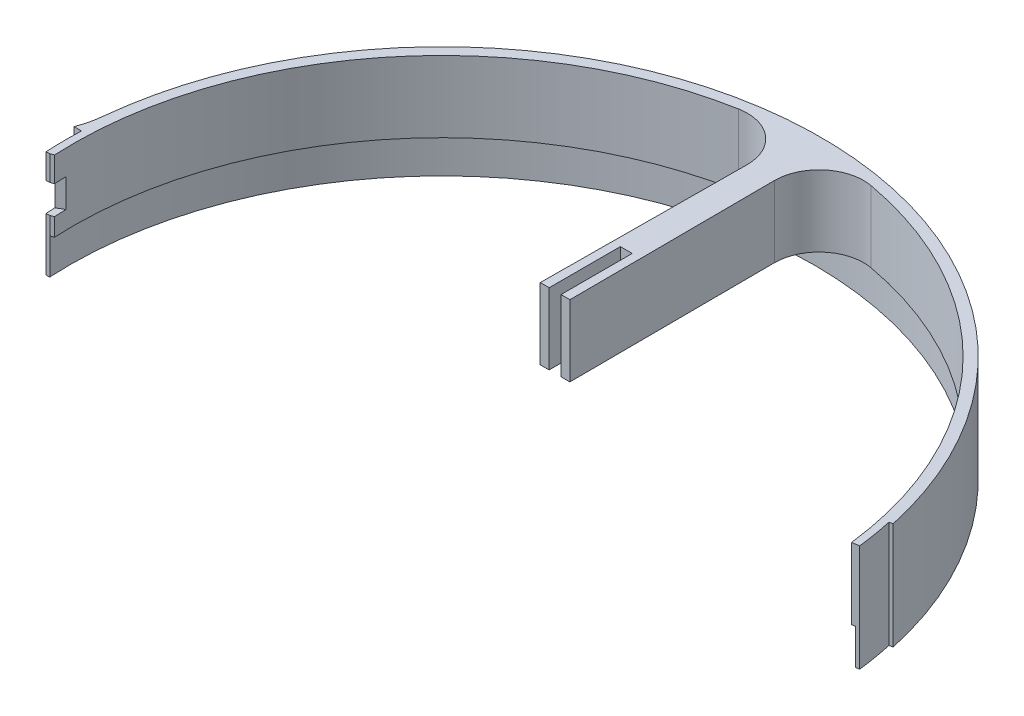
ISO-10303-21;
HEADER;
FILE_DESCRIPTION(('STEP AP214'),'2;1');
FILE_NAME('part.step','',(''),(''),'','','');
FILE_SCHEMA(('AUTOMOTIVE_DESIGN { 1 0 10303 214 1 1 1 1 }'));
ENDSEC;
DATA;
#1=APPLICATION_CONTEXT('core data for automotive mechanical design processes');
#2=APPLICATION_PROTOCOL_DEFINITION('international standard','automotive_design',2000,#1);
#3=PRODUCT_CONTEXT('',#1,'mechanical');
#4=PRODUCT('Part','Part','',(#3));
#5=PRODUCT_RELATED_PRODUCT_CATEGORY('part','',(#4));
#6=PRODUCT_DEFINITION_FORMATION('','',#4);
#7=PRODUCT_DEFINITION_CONTEXT('part definition',#1,'design');
#8=PRODUCT_DEFINITION('design','',#6,#7);
#9=PRODUCT_DEFINITION_SHAPE('','',#8);
#10=(LENGTH_UNIT() NAMED_UNIT(*) SI_UNIT(.MILLI.,.METRE.));
#11=(NAMED_UNIT(*) PLANE_ANGLE_UNIT() SI_UNIT($,.RADIAN.));
#12=(NAMED_UNIT(*) SI_UNIT($,.STERADIAN.) SOLID_ANGLE_UNIT());
#13=UNCERTAINTY_MEASURE_WITH_UNIT(LENGTH_MEASURE(1.E-05),#10,'distance_accuracy_value','');
#14=(GEOMETRIC_REPRESENTATION_CONTEXT(3) GLOBAL_UNCERTAINTY_ASSIGNED_CONTEXT((#13)) GLOBAL_UNIT_ASSIGNED_CONTEXT((#10,
#11,#12)) REPRESENTATION_CONTEXT('',''));
#15=CARTESIAN_POINT('',(0.,0.,0.));
#16=DIRECTION('',(0.,0.,1.));
#17=DIRECTION('',(1.,0.,0.));
#18=AXIS2_PLACEMENT_3D('',#15,#16,#17);
#19=CARTESIAN_POINT('',(0.,20.,0.));
#20=DIRECTION('',(0.,-1.,0.));
#21=DIRECTION('',(0.,0.,-1.));
#22=AXIS2_PLACEMENT_3D('',#19,#20,#21);
#23=CYLINDRICAL_SURFACE('',#22,106.5);
#24=DIRECTION('',(0.,-1.,0.));
#25=VECTOR('',#24,1.);
#26=CARTESIAN_POINT('',(104.058906665546,20.,-22.6714345283063));
#27=LINE('',#26,#25);
#28=CARTESIAN_POINT('',(104.058906665546,-10.,-22.6714345283062));
#29=VERTEX_POINT('',#28);
#30=CARTESIAN_POINT('',(104.058906665546,20.,-22.6714345283063));
#31=VERTEX_POINT('',#30);
#32=EDGE_CURVE('E380',#29,#31,#27,.F.);
#33=ORIENTED_EDGE('',*,*,#32,.F.);
#34=CARTESIAN_POINT('',(0.,-10.,0.));
#35=DIRECTION('',(0.,-1.,0.));
#36=DIRECTION('',(0.,0.,-1.));
#37=AXIS2_PLACEMENT_3D('',#34,#35,#36);
#38=CIRCLE('',#37,106.5);
#39=CARTESIAN_POINT('',(-106.416255204395,-10.,-4.22263286031518));
#40=VERTEX_POINT('',#39);
#41=EDGE_CURVE('E276',#40,#29,#38,.T.);
#42=ORIENTED_EDGE('',*,*,#41,.F.);
#43=DIRECTION('',(0.,-1.,0.));
#44=VECTOR('',#43,1.);
#45=CARTESIAN_POINT('',(-106.416255204395,20.,-4.22263286031518));
#46=LINE('',#45,#44);
#47=CARTESIAN_POINT('',(-106.416255204395,0.,-4.22263286031518));
#48=VERTEX_POINT('',#47);
#49=EDGE_CURVE('E383',#48,#40,#46,.T.);
#50=ORIENTED_EDGE('',*,*,#49,.F.);
#51=CARTESIAN_POINT('',(0.,0.,0.));
#52=DIRECTION('',(0.,-1.,0.));
#53=DIRECTION('',(0.,0.,-1.));
#54=AXIS2_PLACEMENT_3D('',#51,#52,#53);
#55=CIRCLE('',#54,106.5);
#56=CARTESIAN_POINT('',(-105.962177200695,0.,-10.6895744952032));
#57=VERTEX_POINT('',#56);
#58=EDGE_CURVE('E279',#48,#57,#55,.T.);
#59=ORIENTED_EDGE('',*,*,#58,.T.);
#60=DIRECTION('',(0.,-1.,0.));
#61=VECTOR('',#60,1.);
#62=CARTESIAN_POINT('',(-105.962177200695,20.,-10.6895744952032));
#63=LINE('',#62,#61);
#64=CARTESIAN_POINT('',(-105.962177200695,20.,-10.6895744952032));
#65=VERTEX_POINT('',#64);
#66=EDGE_CURVE('E266',#65,#57,#63,.T.);
#67=ORIENTED_EDGE('',*,*,#66,.F.);
#68=CARTESIAN_POINT('',(0.,20.,0.));
#69=DIRECTION('',(0.,1.,0.));
#70=DIRECTION('',(0.,0.,1.));
#71=AXIS2_PLACEMENT_3D('',#68,#69,#70);
#72=CIRCLE('',#71,106.5);
#73=EDGE_CURVE('E248',#31,#65,#72,.T.);
#74=ORIENTED_EDGE('',*,*,#73,.F.);
#75=EDGE_LOOP('',(#33,#42,#50,#59,#67,#74));
#76=FACE_BOUND('',#75,.T.);
#77=ADVANCED_FACE('F30',(#76),#23,.T.);
#78=CARTESIAN_POINT('',(-16.2551502510285,0.,-89.536417676365));
#79=DIRECTION('',(0.,1.,0.));
#80=DIRECTION('',(0.,0.,1.));
#81=AXIS2_PLACEMENT_3D('',#78,#79,#80);
#82=CYLINDRICAL_SURFACE('',#81,12.5);
#83=CARTESIAN_POINT('',(-16.2551502510285,20.,-89.536417676365));
#84=DIRECTION('',(0.,1.,0.));
#85=DIRECTION('',(-0.866025403784443,0.,-0.499999999999992));
#86=AXIS2_PLACEMENT_3D('',#83,#84,#85);
#87=CIRCLE('',#86,12.5);
#88=CARTESIAN_POINT('',(-3.7554232598627,20.,-89.4538032325801));
#89=VERTEX_POINT('',#88);
#90=CARTESIAN_POINT('',(-18.4880005602356,20.,-101.835376148393));
#91=VERTEX_POINT('',#90);
#92=EDGE_CURVE('E260',#89,#91,#87,.T.);
#93=ORIENTED_EDGE('',*,*,#92,.T.);
#94=DIRECTION('',(0.,1.,0.));
#95=VECTOR('',#94,1.);
#96=CARTESIAN_POINT('',(-18.4880005602356,0.,-101.835376148393));
#97=LINE('',#96,#95);
#98=CARTESIAN_POINT('',(-18.4880005602356,0.,-101.835376148393));
#99=VERTEX_POINT('',#98);
#100=EDGE_CURVE('E302',#99,#91,#97,.T.);
#101=ORIENTED_EDGE('',*,*,#100,.F.);
#102=CARTESIAN_POINT('',(-16.2551502510285,0.,-89.536417676365));
#103=DIRECTION('',(0.,1.,0.));
#104=DIRECTION('',(-0.866025403784443,0.,-0.499999999999992));
#105=AXIS2_PLACEMENT_3D('',#102,#103,#104);
#106=CIRCLE('',#105,12.5);
#107=CARTESIAN_POINT('',(-3.7554232598627,0.,-89.4538032325801));
#108=VERTEX_POINT('',#107);
#109=EDGE_CURVE('E256',#108,#99,#106,.T.);
#110=ORIENTED_EDGE('',*,*,#109,.F.);
#111=DIRECTION('',(0.,1.,0.));
#112=VECTOR('',#111,1.);
#113=CARTESIAN_POINT('',(-3.7554232598627,0.,-89.4538032325801));
#114=LINE('',#113,#112);
#115=EDGE_CURVE('E253',#108,#89,#114,.T.);
#116=ORIENTED_EDGE('',*,*,#115,.T.);
#117=EDGE_LOOP('',(#93,#101,#110,#116));
#118=FACE_BOUND('',#117,.T.);
#119=ADVANCED_FACE('F500',(#118),#82,.F.);
#120=CARTESIAN_POINT('',(0.,0.,0.));
#121=DIRECTION('',(0.,1.,0.));
#122=DIRECTION('',(0.,0.,1.));
#123=AXIS2_PLACEMENT_3D('',#120,#121,#122);
#124=PLANE('',#123);
#125=DIRECTION('',(0.986536124588382,0.,-0.163543495383144));
#126=VECTOR('',#125,1.);
#127=CARTESIAN_POINT('',(0.769005145027349,0.,4.63883539841475));
#128=LINE('',#127,#126);
#129=CARTESIAN_POINT('',(102.770065338489,0.,-12.2704388806041));
#130=VERTEX_POINT('',#129);
#131=CARTESIAN_POINT('',(103.757611378022,0.,-12.4341497951175));
#132=VERTEX_POINT('',#131);
#133=EDGE_CURVE('E358',#130,#132,#128,.T.);
#134=ORIENTED_EDGE('',*,*,#133,.F.);
#135=CARTESIAN_POINT('',(0.,0.,0.));
#136=DIRECTION('',(0.,1.,0.));
#137=DIRECTION('',(0.866025403784436,0.,-0.500000000000004));
#138=AXIS2_PLACEMENT_3D('',#135,#136,#137);
#139=CIRCLE('',#138,103.5);
#140=CARTESIAN_POINT('',(18.6829054953159,0.,-101.799798832086));
#141=VERTEX_POINT('',#140);
#142=EDGE_CURVE('E225',#130,#141,#139,.T.);
#143=ORIENTED_EDGE('',*,*,#142,.T.);
#144=CARTESIAN_POINT('',(16.4265159427415,0.,-89.5051371373893));
#145=DIRECTION('',(0.,1.,0.));
#146=DIRECTION('',(0.866025403784436,0.,-0.500000000000004));
#147=AXIS2_PLACEMENT_3D('',#144,#145,#146);
#148=CIRCLE('',#147,12.5);
#149=CARTESIAN_POINT('',(3.92665052845236,0.,-89.4471317526567));
#150=VERTEX_POINT('',#149);
#151=EDGE_CURVE('E250',#141,#150,#148,.T.);
#152=ORIENTED_EDGE('',*,*,#151,.T.);
#153=DIRECTION('',(0.00464043077860177,0.,0.999989233143132));
#154=VECTOR('',#153,1.);
#155=CARTESIAN_POINT('',(4.19434343851814,0.,-31.7606710281651));
#156=LINE('',#155,#154);
#157=CARTESIAN_POINT('',(4.19434343851814,0.,-31.7606710281651));
#158=VERTEX_POINT('',#157);
#159=EDGE_CURVE('E445',#150,#158,#156,.T.);
#160=ORIENTED_EDGE('',*,*,#159,.T.);
#161=DIRECTION('',(0.999999854762667,0.,0.000538956998216711));
#162=VECTOR('',#161,1.);
#163=CARTESIAN_POINT('',(0.0171188517829937,0.,-31.7629223729162));
#164=LINE('',#163,#162);
#165=CARTESIAN_POINT('',(1.69434380161148,0.,-31.7620184206606));
#166=VERTEX_POINT('',#165);
#167=EDGE_CURVE('E240',#166,#158,#164,.T.);
#168=ORIENTED_EDGE('',*,*,#167,.F.);
#169=DIRECTION('',(0.,0.,1.));
#170=VECTOR('',#169,1.);
#171=CARTESIAN_POINT('',(1.69434380161148,0.,0.));
#172=LINE('',#171,#170);
#173=CARTESIAN_POINT('',(1.69434380161148,0.,-51.7620184206606));
#174=VERTEX_POINT('',#173);
#175=EDGE_CURVE('E373',#174,#166,#172,.T.);
#176=ORIENTED_EDGE('',*,*,#175,.F.);
#177=DIRECTION('',(1.,0.,0.));
#178=VECTOR('',#177,1.);
#179=CARTESIAN_POINT('',(0.,0.,-51.7620184206606));
#180=LINE('',#179,#178);
#181=CARTESIAN_POINT('',(-1.63670515697653,0.,-51.7620184206606));
#182=VERTEX_POINT('',#181);
#183=EDGE_CURVE('E370',#182,#174,#180,.T.);
#184=ORIENTED_EDGE('',*,*,#183,.F.);
#185=DIRECTION('',(0.,0.,-1.));
#186=VECTOR('',#185,1.);
#187=CARTESIAN_POINT('',(-1.63670515697652,0.,0.));
#188=LINE('',#187,#186);
#189=CARTESIAN_POINT('',(-1.63670515697653,0.,-31.763813713069));
#190=VERTEX_POINT('',#189);
#191=EDGE_CURVE('E367',#190,#182,#188,.T.);
#192=ORIENTED_EDGE('',*,*,#191,.F.);
#193=DIRECTION('',(0.999999854762667,0.,0.000538956998216711));
#194=VECTOR('',#193,1.);
#195=CARTESIAN_POINT('',(0.0171188517829937,0.,-31.7629223729162));
#196=LINE('',#195,#194);
#197=CARTESIAN_POINT('',(-4.13670479388319,0.,-31.7651611055646));
#198=VERTEX_POINT('',#197);
#199=EDGE_CURVE('E364',#198,#190,#196,.T.);
#200=ORIENTED_EDGE('',*,*,#199,.F.);
#201=DIRECTION('',(0.00660915550279129,0.,-0.999978159293262));
#202=VECTOR('',#201,1.);
#203=CARTESIAN_POINT('',(-4.13670479388319,0.,-31.7651611055646));
#204=LINE('',#203,#202);
#205=EDGE_CURVE('E257',#198,#108,#204,.T.);
#206=ORIENTED_EDGE('',*,*,#205,.T.);
#207=ORIENTED_EDGE('',*,*,#109,.T.);
#208=CARTESIAN_POINT('',(0.,0.,0.));
#209=DIRECTION('',(0.,1.,0.));
#210=DIRECTION('',(-0.866025403784443,0.,-0.499999999999992));
#211=AXIS2_PLACEMENT_3D('',#208,#209,#210);
#212=CIRCLE('',#211,103.5);
#213=CARTESIAN_POINT('',(-103.35935119248,0.,5.3939337287024));
#214=VERTEX_POINT('',#213);
#215=EDGE_CURVE('E254',#99,#214,#212,.T.);
#216=ORIENTED_EDGE('',*,*,#215,.T.);
#217=DIRECTION('',(0.936482367375643,0.,-0.35071466407111));
#218=VECTOR('',#217,1.);
#219=CARTESIAN_POINT('',(-10.9417070222664,0.,-29.2166731108373));
#220=LINE('',#219,#218);
#221=CARTESIAN_POINT('',(-104.341047451675,0.,5.76158109266535));
#222=VERTEX_POINT('',#221);
#223=EDGE_CURVE('E361',#222,#214,#220,.T.);
#224=ORIENTED_EDGE('',*,*,#223,.F.);
#225=CARTESIAN_POINT('',(0.,0.,0.));
#226=DIRECTION('',(0.,-1.,0.));
#227=DIRECTION('',(0.,0.,-1.));
#228=AXIS2_PLACEMENT_3D('',#225,#226,#227);
#229=CIRCLE('',#228,104.5);
#230=EDGE_CURVE('E34',#222,#132,#229,.T.);
#231=ORIENTED_EDGE('',*,*,#230,.T.);
#232=EDGE_LOOP('',(#134,#143,#152,#160,#168,#176,#184,#192,#200,#206,#207,#216,#224,#231));
#233=FACE_BOUND('',#232,.T.);
#234=ADVANCED_FACE('F459',(#233),#124,.F.);
#235=CARTESIAN_POINT('',(16.4265159427415,0.,-89.5051371373893));
#236=DIRECTION('',(0.,1.,0.));
#237=DIRECTION('',(0.,0.,1.));
#238=AXIS2_PLACEMENT_3D('',#235,#236,#237);
#239=CYLINDRICAL_SURFACE('',#238,12.5);
#240=CARTESIAN_POINT('',(16.4265159427415,20.,-89.5051371373893));
#241=DIRECTION('',(0.,1.,0.));
#242=DIRECTION('',(0.866025403784436,0.,-0.500000000000004));
#243=AXIS2_PLACEMENT_3D('',#240,#241,#242);
#244=CIRCLE('',#243,12.5);
#245=CARTESIAN_POINT('',(18.6829054953159,20.,-101.799798832086));
#246=VERTEX_POINT('',#245);
#247=CARTESIAN_POINT('',(3.92665052845236,20.,-89.4471317526567));
#248=VERTEX_POINT('',#247);
#249=EDGE_CURVE('E224',#246,#248,#244,.T.);
#250=ORIENTED_EDGE('',*,*,#249,.T.);
#251=DIRECTION('',(0.,1.,0.));
#252=VECTOR('',#251,1.);
#253=CARTESIAN_POINT('',(3.92665052845236,0.,-89.4471317526567));
#254=LINE('',#253,#252);
#255=EDGE_CURVE('E220',#150,#248,#254,.T.);
#256=ORIENTED_EDGE('',*,*,#255,.F.);
#257=ORIENTED_EDGE('',*,*,#151,.F.);
#258=DIRECTION('',(0.,1.,0.));
#259=VECTOR('',#258,1.);
#260=CARTESIAN_POINT('',(18.6829054953159,0.,-101.799798832086));
#261=LINE('',#260,#259);
#262=EDGE_CURVE('E447',#141,#246,#261,.T.);
#263=ORIENTED_EDGE('',*,*,#262,.T.);
#264=EDGE_LOOP('',(#250,#256,#257,#263));
#265=FACE_BOUND('',#264,.T.);
#266=ADVANCED_FACE('F454',(#265),#239,.F.);
#267=CARTESIAN_POINT('',(0.,20.,0.));
#268=DIRECTION('',(0.,1.,0.));
#269=DIRECTION('',(0.,0.,1.));
#270=AXIS2_PLACEMENT_3D('',#267,#268,#269);
#271=PLANE('',#270);
#272=CARTESIAN_POINT('',(0.,20.,0.));
#273=DIRECTION('',(0.,1.,0.));
#274=DIRECTION('',(0.866025403784436,0.,-0.500000000000004));
#275=AXIS2_PLACEMENT_3D('',#272,#273,#274);
#276=CIRCLE('',#275,103.5);
#277=CARTESIAN_POINT('',(102.770065338489,20.,-12.2704388806041));
#278=VERTEX_POINT('',#277);
#279=EDGE_CURVE('E251',#278,#246,#276,.T.);
#280=ORIENTED_EDGE('',*,*,#279,.F.);
#281=DIRECTION('',(0.986536124588382,0.,-0.163543495383144));
#282=VECTOR('',#281,1.);
#283=CARTESIAN_POINT('',(0.769005145027349,20.,4.63883539841475));
#284=LINE('',#283,#282);
#285=CARTESIAN_POINT('',(104.745138243395,20.,-12.5978575310256));
#286=VERTEX_POINT('',#285);
#287=EDGE_CURVE('E352',#278,#286,#284,.T.);
#288=ORIENTED_EDGE('',*,*,#287,.T.);
#289=CARTESIAN_POINT('',(0.,20.,0.));
#290=DIRECTION('',(0.,1.,0.));
#291=DIRECTION('',(0.,0.,1.));
#292=AXIS2_PLACEMENT_3D('',#289,#290,#291);
#293=CIRCLE('',#292,105.5);
#294=CARTESIAN_POINT('',(103.081827729719,20.,-22.4585572087916));
#295=VERTEX_POINT('',#294);
#296=EDGE_CURVE('E349',#286,#295,#293,.T.);
#297=ORIENTED_EDGE('',*,*,#296,.T.);
#298=DIRECTION('',(0.977078935826718,0.,-0.212877319514617));
#299=VECTOR('',#298,1.);
#300=CARTESIAN_POINT('',(1.04876452560866E-13,20.,4.81369142072536E-13));
#301=LINE('',#300,#299);
#302=EDGE_CURVE('E346',#295,#31,#301,.T.);
#303=ORIENTED_EDGE('',*,*,#302,.T.);
#304=ORIENTED_EDGE('',*,*,#73,.T.);
#305=CARTESIAN_POINT('',(-130.581135121897,20.,-13.1731605411422));
#306=DIRECTION('',(0.,1.,0.));
#307=DIRECTION('',(0.,0.,-1.));
#308=AXIS2_PLACEMENT_3D('',#305,#306,#307);
#309=CIRCLE('',#308,24.7439141764898);
#310=CARTESIAN_POINT('',(-107.496191821736,20.,-4.2654851091439));
#311=VERTEX_POINT('',#310);
#312=EDGE_CURVE('E262',#311,#65,#309,.T.);
#313=ORIENTED_EDGE('',*,*,#312,.F.);
#314=DIRECTION('',(0.999213663891036,0.,0.0396491348386389));
#315=VECTOR('',#314,1.);
#316=CARTESIAN_POINT('',(0.,20.,-1.42135470822023E-13));
#317=LINE('',#316,#315);
#318=CARTESIAN_POINT('',(-105.417041540504,20.,-4.18298372547655));
#319=VERTEX_POINT('',#318);
#320=EDGE_CURVE('E343',#311,#319,#317,.T.);
#321=ORIENTED_EDGE('',*,*,#320,.T.);
#322=CARTESIAN_POINT('',(0.,20.,0.));
#323=DIRECTION('',(0.,1.,0.));
#324=DIRECTION('',(0.,0.,1.));
#325=AXIS2_PLACEMENT_3D('',#322,#323,#324);
#326=CIRCLE('',#325,105.5);
#327=CARTESIAN_POINT('',(-105.339526374657,20.,5.81671583996359));
#328=VERTEX_POINT('',#327);
#329=EDGE_CURVE('E340',#319,#328,#326,.T.);
#330=ORIENTED_EDGE('',*,*,#329,.T.);
#331=DIRECTION('',(0.998478922982534,0.,-0.0551347472982325));
#332=VECTOR('',#331,1.);
#333=CARTESIAN_POINT('',(0.,20.,0.));
#334=LINE('',#333,#332);
#335=CARTESIAN_POINT('',(-104.341047451675,20.,5.76158109266536));
#336=VERTEX_POINT('',#335);
#337=EDGE_CURVE('E337',#328,#336,#334,.T.);
#338=ORIENTED_EDGE('',*,*,#337,.T.);
#339=DIRECTION('',(0.936482367375643,0.,-0.35071466407111));
#340=VECTOR('',#339,1.);
#341=CARTESIAN_POINT('',(-10.9417070222664,20.,-29.2166731108373));
#342=LINE('',#341,#340);
#343=CARTESIAN_POINT('',(-103.35935119248,20.,5.3939337287024));
#344=VERTEX_POINT('',#343);
#345=EDGE_CURVE('E334',#336,#344,#342,.T.);
#346=ORIENTED_EDGE('',*,*,#345,.T.);
#347=CARTESIAN_POINT('',(0.,20.,0.));
#348=DIRECTION('',(0.,1.,0.));
#349=DIRECTION('',(-0.866025403784443,0.,-0.499999999999992));
#350=AXIS2_PLACEMENT_3D('',#347,#348,#349);
#351=CIRCLE('',#350,103.5);
#352=EDGE_CURVE('E258',#91,#344,#351,.T.);
#353=ORIENTED_EDGE('',*,*,#352,.F.);
#354=ORIENTED_EDGE('',*,*,#92,.F.);
#355=DIRECTION('',(0.00660915550279129,0.,-0.999978159293262));
#356=VECTOR('',#355,1.);
#357=CARTESIAN_POINT('',(-4.13670479388319,20.,-31.7651611055646));
#358=LINE('',#357,#356);
#359=CARTESIAN_POINT('',(-4.13670479388319,20.,-31.7651611055646));
#360=VERTEX_POINT('',#359);
#361=EDGE_CURVE('E261',#360,#89,#358,.T.);
#362=ORIENTED_EDGE('',*,*,#361,.F.);
#363=DIRECTION('',(0.999999854762667,0.,0.000538956998216711));
#364=VECTOR('',#363,1.);
#365=CARTESIAN_POINT('',(0.0171188517829937,20.,-31.7629223729162));
#366=LINE('',#365,#364);
#367=CARTESIAN_POINT('',(-1.63670515697653,20.,-31.763813713069));
#368=VERTEX_POINT('',#367);
#369=EDGE_CURVE('E331',#360,#368,#366,.T.);
#370=ORIENTED_EDGE('',*,*,#369,.T.);
#371=DIRECTION('',(0.,0.,-1.));
#372=VECTOR('',#371,1.);
#373=CARTESIAN_POINT('',(-1.63670515697652,20.,0.));
#374=LINE('',#373,#372);
#375=CARTESIAN_POINT('',(-1.63670515697653,20.,-51.7620184206606));
#376=VERTEX_POINT('',#375);
#377=EDGE_CURVE('E328',#368,#376,#374,.T.);
#378=ORIENTED_EDGE('',*,*,#377,.T.);
#379=DIRECTION('',(1.,0.,0.));
#380=VECTOR('',#379,1.);
#381=CARTESIAN_POINT('',(0.,20.,-51.7620184206606));
#382=LINE('',#381,#380);
#383=CARTESIAN_POINT('',(1.69434380161148,20.,-51.7620184206606));
#384=VERTEX_POINT('',#383);
#385=EDGE_CURVE('E326',#376,#384,#382,.T.);
#386=ORIENTED_EDGE('',*,*,#385,.T.);
#387=DIRECTION('',(0.,0.,1.));
#388=VECTOR('',#387,1.);
#389=CARTESIAN_POINT('',(1.69434380161148,20.,0.));
#390=LINE('',#389,#388);
#391=CARTESIAN_POINT('',(1.69434380161148,20.,-31.7620184206606));
#392=VERTEX_POINT('',#391);
#393=EDGE_CURVE('E233',#384,#392,#390,.T.);
#394=ORIENTED_EDGE('',*,*,#393,.T.);
#395=DIRECTION('',(0.999999854762667,0.,0.000538956998216711));
#396=VECTOR('',#395,1.);
#397=CARTESIAN_POINT('',(0.0171188517829937,20.,-31.7629223729162));
#398=LINE('',#397,#396);
#399=CARTESIAN_POINT('',(4.19434343851814,20.,-31.7606710281651));
#400=VERTEX_POINT('',#399);
#401=EDGE_CURVE('E229',#392,#400,#398,.T.);
#402=ORIENTED_EDGE('',*,*,#401,.T.);
#403=DIRECTION('',(0.00464043077860177,0.,0.999989233143132));
#404=VECTOR('',#403,1.);
#405=CARTESIAN_POINT('',(4.19434343851814,20.,-31.7606710281651));
#406=LINE('',#405,#404);
#407=EDGE_CURVE('E214',#248,#400,#406,.T.);
#408=ORIENTED_EDGE('',*,*,#407,.F.);
#409=ORIENTED_EDGE('',*,*,#249,.F.);
#410=EDGE_LOOP('',(#280,#288,#297,#303,#304,#313,#321,#330,#338,#346,#353,#354,#362,#370,#378,
#386,#394,#402,#408,#409));
#411=FACE_BOUND('',#410,.T.);
#412=ADVANCED_FACE('F230',(#411),#271,.T.);
#413=CARTESIAN_POINT('',(0.,0.,0.));
#414=DIRECTION('',(0.,1.,0.));
#415=DIRECTION('',(0.,0.,1.));
#416=AXIS2_PLACEMENT_3D('',#413,#414,#415);
#417=CYLINDRICAL_SURFACE('',#416,103.5);
#418=DIRECTION('',(0.,1.,0.));
#419=VECTOR('',#418,1.);
#420=CARTESIAN_POINT('',(102.770065338489,0.,-12.2704388806041));
#421=LINE('',#420,#419);
#422=EDGE_CURVE('E377',#278,#130,#421,.F.);
#423=ORIENTED_EDGE('',*,*,#422,.F.);
#424=ORIENTED_EDGE('',*,*,#279,.T.);
#425=ORIENTED_EDGE('',*,*,#262,.F.);
#426=ORIENTED_EDGE('',*,*,#142,.F.);
#427=EDGE_LOOP('',(#423,#424,#425,#426));
#428=FACE_BOUND('',#427,.T.);
#429=ADVANCED_FACE('F458',(#428),#417,.F.);
#430=CARTESIAN_POINT('',(4.19434343851814,0.,-31.7606710281651));
#431=DIRECTION('',(-0.999989233143132,0.,0.00464043077860177));
#432=DIRECTION('',(0.00464043077860177,0.,0.999989233143132));
#433=AXIS2_PLACEMENT_3D('',#430,#431,#432);
#434=PLANE('',#433);
#435=ORIENTED_EDGE('',*,*,#407,.T.);
#436=DIRECTION('',(0.,1.,0.));
#437=VECTOR('',#436,1.);
#438=CARTESIAN_POINT('',(4.19434343851814,0.,-31.7606710281651));
#439=LINE('',#438,#437);
#440=EDGE_CURVE('E219',#158,#400,#439,.T.);
#441=ORIENTED_EDGE('',*,*,#440,.F.);
#442=ORIENTED_EDGE('',*,*,#159,.F.);
#443=ORIENTED_EDGE('',*,*,#255,.T.);
#444=EDGE_LOOP('',(#435,#441,#442,#443));
#445=FACE_BOUND('',#444,.T.);
#446=ADVANCED_FACE('F216',(#445),#434,.F.);
#447=CARTESIAN_POINT('',(-4.13670479388319,0.,-31.7651611055646));
#448=DIRECTION('',(0.999978159293262,0.,0.00660915550279129));
#449=DIRECTION('',(0.00660915550279129,0.,-0.999978159293262));
#450=AXIS2_PLACEMENT_3D('',#447,#448,#449);
#451=PLANE('',#450);
#452=ORIENTED_EDGE('',*,*,#361,.T.);
#453=ORIENTED_EDGE('',*,*,#115,.F.);
#454=ORIENTED_EDGE('',*,*,#205,.F.);
#455=DIRECTION('',(0.,1.,0.));
#456=VECTOR('',#455,1.);
#457=CARTESIAN_POINT('',(-4.13670479388319,0.,-31.7651611055646));
#458=LINE('',#457,#456);
#459=EDGE_CURVE('E300',#198,#360,#458,.T.);
#460=ORIENTED_EDGE('',*,*,#459,.T.);
#461=EDGE_LOOP('',(#452,#453,#454,#460));
#462=FACE_BOUND('',#461,.T.);
#463=ADVANCED_FACE('F504',(#462),#451,.F.);
#464=CARTESIAN_POINT('',(0.,0.,0.));
#465=DIRECTION('',(0.,1.,0.));
#466=DIRECTION('',(0.,0.,1.));
#467=AXIS2_PLACEMENT_3D('',#464,#465,#466);
#468=CYLINDRICAL_SURFACE('',#467,103.5);
#469=DIRECTION('',(0.,1.,0.));
#470=VECTOR('',#469,1.);
#471=CARTESIAN_POINT('',(-103.35935119248,0.,5.3939337287024));
#472=LINE('',#471,#470);
#473=CARTESIAN_POINT('',(-103.35935119248,5.,5.3939337287024));
#474=VERTEX_POINT('',#473);
#475=EDGE_CURVE('E386',#214,#474,#472,.T.);
#476=ORIENTED_EDGE('',*,*,#475,.F.);
#477=ORIENTED_EDGE('',*,*,#215,.F.);
#478=ORIENTED_EDGE('',*,*,#100,.T.);
#479=ORIENTED_EDGE('',*,*,#352,.T.);
#480=CARTESIAN_POINT('',(-103.35935119248,13.,5.3939337287024));
#481=VERTEX_POINT('',#480);
#482=EDGE_CURVE('E387',#481,#344,#472,.T.);
#483=ORIENTED_EDGE('',*,*,#482,.F.);
#484=CARTESIAN_POINT('',(0.,13.,0.));
#485=DIRECTION('',(0.,1.,0.));
#486=DIRECTION('',(0.,0.,1.));
#487=AXIS2_PLACEMENT_3D('',#484,#485,#486);
#488=CIRCLE('',#487,103.5);
#489=CARTESIAN_POINT('',(-103.479479498253,13.,2.06090338702359));
#490=VERTEX_POINT('',#489);
#491=EDGE_CURVE('E55',#481,#490,#488,.F.);
#492=ORIENTED_EDGE('',*,*,#491,.T.);
#493=DIRECTION('',(0.,1.,0.));
#494=VECTOR('',#493,1.);
#495=CARTESIAN_POINT('',(-103.479479498253,0.,2.06090338702359));
#496=LINE('',#495,#494);
#497=CARTESIAN_POINT('',(-103.479479498253,5.,2.06090338702359));
#498=VERTEX_POINT('',#497);
#499=EDGE_CURVE('E269',#490,#498,#496,.F.);
#500=ORIENTED_EDGE('',*,*,#499,.T.);
#501=CARTESIAN_POINT('',(0.,5.,0.));
#502=DIRECTION('',(0.,-1.,0.));
#503=DIRECTION('',(0.,0.,-1.));
#504=AXIS2_PLACEMENT_3D('',#501,#502,#503);
#505=CIRCLE('',#504,103.5);
#506=EDGE_CURVE('E47',#498,#474,#505,.F.);
#507=ORIENTED_EDGE('',*,*,#506,.T.);
#508=EDGE_LOOP('',(#476,#477,#478,#479,#483,#492,#500,#507));
#509=FACE_BOUND('',#508,.T.);
#510=ADVANCED_FACE('F496',(#509),#468,.F.);
#511=CARTESIAN_POINT('',(-99.8886699579633,5.,-0.012251467671311));
#512=DIRECTION('',(-0.500000000000001,0.,-0.866025403784438));
#513=DIRECTION('',(-0.866025403784438,0.,0.500000000000001));
#514=AXIS2_PLACEMENT_3D('',#511,#512,#513);
#515=PLANE('',#514);
#516=DIRECTION('',(0.,1.,0.));
#517=VECTOR('',#516,1.);
#518=CARTESIAN_POINT('',(-105.451475152251,-10.01,3.19943560870005));
#519=LINE('',#518,#517);
#520=CARTESIAN_POINT('',(-105.451475152251,5.,3.19943560870004));
#521=VERTEX_POINT('',#520);
#522=CARTESIAN_POINT('',(-105.451475152251,13.,3.19943560870004));
#523=VERTEX_POINT('',#522);
#524=EDGE_CURVE('E390',#521,#523,#519,.T.);
#525=ORIENTED_EDGE('',*,*,#524,.F.);
#526=DIRECTION('',(-0.866025403784438,0.,0.500000000000001));
#527=VECTOR('',#526,1.);
#528=CARTESIAN_POINT('',(-99.8886699579633,5.,-0.012251467671311));
#529=LINE('',#528,#527);
#530=EDGE_CURVE('E274',#498,#521,#529,.T.);
#531=ORIENTED_EDGE('',*,*,#530,.F.);
#532=ORIENTED_EDGE('',*,*,#499,.F.);
#533=DIRECTION('',(-0.866025403784438,0.,0.500000000000001));
#534=VECTOR('',#533,1.);
#535=CARTESIAN_POINT('',(-99.8886699579633,13.,-0.012251467671311));
#536=LINE('',#535,#534);
#537=EDGE_CURVE('E272',#490,#523,#536,.T.);
#538=ORIENTED_EDGE('',*,*,#537,.T.);
#539=EDGE_LOOP('',(#525,#531,#532,#538));
#540=FACE_BOUND('',#539,.T.);
#541=ADVANCED_FACE('F525',(#540),#515,.F.);
#542=CARTESIAN_POINT('',(-99.8886699579633,13.,-0.012251467671311));
#543=DIRECTION('',(0.,1.,0.));
#544=DIRECTION('',(0.,0.,1.));
#545=AXIS2_PLACEMENT_3D('',#542,#543,#544);
#546=PLANE('',#545);
#547=CARTESIAN_POINT('',(0.,13.,0.));
#548=DIRECTION('',(0.,1.,0.));
#549=DIRECTION('',(0.,0.,1.));
#550=AXIS2_PLACEMENT_3D('',#547,#548,#549);
#551=CIRCLE('',#550,105.5);
#552=CARTESIAN_POINT('',(-105.339526374657,13.,5.81671583996359));
#553=VERTEX_POINT('',#552);
#554=EDGE_CURVE('E393',#523,#553,#551,.T.);
#555=ORIENTED_EDGE('',*,*,#554,.F.);
#556=ORIENTED_EDGE('',*,*,#537,.F.);
#557=ORIENTED_EDGE('',*,*,#491,.F.);
#558=DIRECTION('',(0.936482367375643,0.,-0.35071466407111));
#559=VECTOR('',#558,1.);
#560=CARTESIAN_POINT('',(-98.5399692535456,13.,3.58906481004855));
#561=LINE('',#560,#559);
#562=CARTESIAN_POINT('',(-104.341047451675,13.,5.76158109266536));
#563=VERTEX_POINT('',#562);
#564=EDGE_CURVE('E399',#563,#481,#561,.T.);
#565=ORIENTED_EDGE('',*,*,#564,.F.);
#566=DIRECTION('',(0.998478922982534,0.,-0.0551347472982325));
#567=VECTOR('',#566,1.);
#568=CARTESIAN_POINT('',(-99.5843498934398,13.,5.49892225048969));
#569=LINE('',#568,#567);
#570=EDGE_CURVE('E396',#553,#563,#569,.T.);
#571=ORIENTED_EDGE('',*,*,#570,.F.);
#572=EDGE_LOOP('',(#555,#556,#557,#565,#571));
#573=FACE_BOUND('',#572,.T.);
#574=ADVANCED_FACE('F527',(#573),#546,.F.);
#575=CARTESIAN_POINT('',(-99.8886699579633,5.,-0.012251467671311));
#576=DIRECTION('',(0.,-1.,0.));
#577=DIRECTION('',(0.,0.,-1.));
#578=AXIS2_PLACEMENT_3D('',#575,#576,#577);
#579=PLANE('',#578);
#580=CARTESIAN_POINT('',(0.,5.,0.));
#581=DIRECTION('',(0.,-1.,0.));
#582=DIRECTION('',(0.,0.,-1.));
#583=AXIS2_PLACEMENT_3D('',#580,#581,#582);
#584=CIRCLE('',#583,105.5);
#585=CARTESIAN_POINT('',(-105.339526374657,5.,5.81671583996359));
#586=VERTEX_POINT('',#585);
#587=EDGE_CURVE('E402',#586,#521,#584,.T.);
#588=ORIENTED_EDGE('',*,*,#587,.F.);
#589=DIRECTION('',(-0.998478922982534,0.,0.0551347472982325));
#590=VECTOR('',#589,1.);
#591=CARTESIAN_POINT('',(-99.5843498934398,5.,5.49892225048969));
#592=LINE('',#591,#590);
#593=CARTESIAN_POINT('',(-104.341047451675,5.,5.76158109266536));
#594=VERTEX_POINT('',#593);
#595=EDGE_CURVE('E244',#594,#586,#592,.T.);
#596=ORIENTED_EDGE('',*,*,#595,.F.);
#597=DIRECTION('',(-0.936482367375643,0.,0.35071466407111));
#598=VECTOR('',#597,1.);
#599=CARTESIAN_POINT('',(-98.5399692535456,5.,3.58906481004855));
#600=LINE('',#599,#598);
#601=EDGE_CURVE('E241',#474,#594,#600,.T.);
#602=ORIENTED_EDGE('',*,*,#601,.F.);
#603=ORIENTED_EDGE('',*,*,#506,.F.);
#604=ORIENTED_EDGE('',*,*,#530,.T.);
#605=EDGE_LOOP('',(#588,#596,#602,#603,#604));
#606=FACE_BOUND('',#605,.T.);
#607=ADVANCED_FACE('F414',(#606),#579,.F.);
#608=DIRECTION('',(0.999213663891036,0.,0.0396491348386389));
#609=VECTOR('',#608,1.);
#610=CARTESIAN_POINT('',(0.,0.,-1.42135470822023E-13));
#611=LINE('',#610,#609);
#612=CARTESIAN_POINT('',(-107.496191821736,0.,-4.2654851091439));
#613=VERTEX_POINT('',#612);
#614=EDGE_CURVE('E355',#613,#48,#611,.T.);
#615=ORIENTED_EDGE('',*,*,#614,.F.);
#616=CARTESIAN_POINT('',(-130.581135121897,0.,-13.1731605411422));
#617=DIRECTION('',(0.,1.,0.));
#618=DIRECTION('',(0.,0.,-1.));
#619=AXIS2_PLACEMENT_3D('',#616,#617,#618);
#620=CIRCLE('',#619,24.7439141764898);
#621=EDGE_CURVE('E265',#613,#57,#620,.T.);
#622=ORIENTED_EDGE('',*,*,#621,.T.);
#623=ORIENTED_EDGE('',*,*,#58,.F.);
#624=EDGE_LOOP('',(#615,#622,#623));
#625=FACE_BOUND('',#624,.T.);
#626=ADVANCED_FACE('F480',(#625),#124,.F.);
#627=CARTESIAN_POINT('',(-130.581135121897,20.,-13.1731605411422));
#628=DIRECTION('',(0.,-1.,0.));
#629=DIRECTION('',(0.,0.,-1.));
#630=AXIS2_PLACEMENT_3D('',#627,#628,#629);
#631=CYLINDRICAL_SURFACE('',#630,24.7439141764898);
#632=ORIENTED_EDGE('',*,*,#621,.F.);
#633=DIRECTION('',(0.,-1.,0.));
#634=VECTOR('',#633,1.);
#635=CARTESIAN_POINT('',(-107.496191821736,20.,-4.2654851091439));
#636=LINE('',#635,#634);
#637=EDGE_CURVE('E235',#613,#311,#636,.F.);
#638=ORIENTED_EDGE('',*,*,#637,.T.);
#639=ORIENTED_EDGE('',*,*,#312,.T.);
#640=ORIENTED_EDGE('',*,*,#66,.T.);
#641=EDGE_LOOP('',(#632,#638,#639,#640));
#642=FACE_BOUND('',#641,.T.);
#643=ADVANCED_FACE('F482',(#642),#631,.F.);
#644=CARTESIAN_POINT('',(0.,-10.,0.));
#645=DIRECTION('',(0.,-1.,0.));
#646=DIRECTION('',(0.,0.,-1.));
#647=AXIS2_PLACEMENT_3D('',#644,#645,#646);
#648=PLANE('',#647);
#649=CARTESIAN_POINT('',(0.,-10.,0.));
#650=DIRECTION('',(0.,-1.,0.));
#651=DIRECTION('',(0.,0.,-1.));
#652=AXIS2_PLACEMENT_3D('',#649,#650,#651);
#653=CIRCLE('',#652,105.5);
#654=CARTESIAN_POINT('',(103.081827729719,-10.,-22.4585572087916));
#655=VERTEX_POINT('',#654);
#656=CARTESIAN_POINT('',(104.745138243395,-10.,-12.5978575310256));
#657=VERTEX_POINT('',#656);
#658=EDGE_CURVE('E318',#655,#657,#653,.T.);
#659=ORIENTED_EDGE('',*,*,#658,.T.);
#660=DIRECTION('',(-0.986536124588382,0.,0.163543495383144));
#661=VECTOR('',#660,1.);
#662=CARTESIAN_POINT('',(0.769005145027349,-10.,4.63883539841475));
#663=LINE('',#662,#661);
#664=CARTESIAN_POINT('',(103.757611378022,-10.,-12.4341497951175));
#665=VERTEX_POINT('',#664);
#666=EDGE_CURVE('E321',#657,#665,#663,.T.);
#667=ORIENTED_EDGE('',*,*,#666,.T.);
#668=CARTESIAN_POINT('',(0.,-10.,0.));
#669=DIRECTION('',(0.,-1.,0.));
#670=DIRECTION('',(0.,0.,-1.));
#671=AXIS2_PLACEMENT_3D('',#668,#669,#670);
#672=CIRCLE('',#671,104.5);
#673=CARTESIAN_POINT('',(-104.341047451675,-10.,5.76158109266535));
#674=VERTEX_POINT('',#673);
#675=EDGE_CURVE('E280',#674,#665,#672,.T.);
#676=ORIENTED_EDGE('',*,*,#675,.F.);
#677=DIRECTION('',(-0.998478922982534,0.,0.0551347472982325));
#678=VECTOR('',#677,1.);
#679=CARTESIAN_POINT('',(0.,-10.,0.));
#680=LINE('',#679,#678);
#681=CARTESIAN_POINT('',(-105.339526374657,-10.,5.81671583996359));
#682=VERTEX_POINT('',#681);
#683=EDGE_CURVE('E307',#674,#682,#680,.T.);
#684=ORIENTED_EDGE('',*,*,#683,.T.);
#685=CARTESIAN_POINT('',(0.,-10.,0.));
#686=DIRECTION('',(0.,-1.,0.));
#687=DIRECTION('',(0.,0.,-1.));
#688=AXIS2_PLACEMENT_3D('',#685,#686,#687);
#689=CIRCLE('',#688,105.5);
#690=CARTESIAN_POINT('',(-105.417041540504,-10.,-4.18298372547655));
#691=VERTEX_POINT('',#690);
#692=EDGE_CURVE('E310',#682,#691,#689,.T.);
#693=ORIENTED_EDGE('',*,*,#692,.T.);
#694=DIRECTION('',(-0.999213663891036,0.,-0.0396491348386389));
#695=VECTOR('',#694,1.);
#696=CARTESIAN_POINT('',(0.,-10.,-1.42135470822023E-13));
#697=LINE('',#696,#695);
#698=EDGE_CURVE('E313',#691,#40,#697,.T.);
#699=ORIENTED_EDGE('',*,*,#698,.T.);
#700=ORIENTED_EDGE('',*,*,#41,.T.);
#701=DIRECTION('',(-0.977078935826718,0.,0.212877319514617));
#702=VECTOR('',#701,1.);
#703=CARTESIAN_POINT('',(1.04876452560866E-13,-10.,4.81369142072536E-13));
#704=LINE('',#703,#702);
#705=EDGE_CURVE('E315',#29,#655,#704,.T.);
#706=ORIENTED_EDGE('',*,*,#705,.T.);
#707=EDGE_LOOP('',(#659,#667,#676,#684,#693,#699,#700,#706));
#708=FACE_BOUND('',#707,.T.);
#709=ADVANCED_FACE('F461',(#708),#648,.T.);
#710=CARTESIAN_POINT('',(0.,-10.,0.));
#711=DIRECTION('',(0.,1.,0.));
#712=DIRECTION('',(0.,0.,1.));
#713=AXIS2_PLACEMENT_3D('',#710,#711,#712);
#714=CYLINDRICAL_SURFACE('',#713,104.5);
#715=ORIENTED_EDGE('',*,*,#675,.T.);
#716=DIRECTION('',(0.,1.,0.));
#717=VECTOR('',#716,1.);
#718=CARTESIAN_POINT('',(103.757611378022,-10.,-12.4341497951175));
#719=LINE('',#718,#717);
#720=EDGE_CURVE('E305',#665,#132,#719,.T.);
#721=ORIENTED_EDGE('',*,*,#720,.T.);
#722=ORIENTED_EDGE('',*,*,#230,.F.);
#723=DIRECTION('',(0.,1.,0.));
#724=VECTOR('',#723,1.);
#725=CARTESIAN_POINT('',(-104.341047451675,-10.,5.76158109266535));
#726=LINE('',#725,#724);
#727=EDGE_CURVE('E303',#222,#674,#726,.F.);
#728=ORIENTED_EDGE('',*,*,#727,.T.);
#729=EDGE_LOOP('',(#715,#721,#722,#728));
#730=FACE_BOUND('',#729,.T.);
#731=ADVANCED_FACE('F32',(#730),#714,.F.);
#732=CARTESIAN_POINT('',(101.644150293604,-10.01,-12.0837897784012));
#733=DIRECTION('',(0.163543495383144,0.,0.986536124588382));
#734=DIRECTION('',(0.986536124588382,0.,-0.163543495383144));
#735=AXIS2_PLACEMENT_3D('',#732,#733,#734);
#736=PLANE('',#735);
#737=ORIENTED_EDGE('',*,*,#287,.F.);
#738=ORIENTED_EDGE('',*,*,#422,.T.);
#739=ORIENTED_EDGE('',*,*,#133,.T.);
#740=ORIENTED_EDGE('',*,*,#720,.F.);
#741=ORIENTED_EDGE('',*,*,#666,.F.);
#742=DIRECTION('',(0.,1.,0.));
#743=VECTOR('',#742,1.);
#744=CARTESIAN_POINT('',(104.745138243395,-10.01,-12.5978575310256));
#745=LINE('',#744,#743);
#746=EDGE_CURVE('E285',#657,#286,#745,.T.);
#747=ORIENTED_EDGE('',*,*,#746,.T.);
#748=EDGE_LOOP('',(#737,#738,#739,#740,#741,#747));
#749=FACE_BOUND('',#748,.T.);
#750=ADVANCED_FACE('F457',(#749),#736,.T.);
#751=CARTESIAN_POINT('',(4.19434343851814,-10.01,-31.7606710281651));
#752=DIRECTION('',(-0.000538956998216711,0.,0.999999854762666));
#753=DIRECTION('',(0.999999854762667,0.,0.000538956998216711));
#754=AXIS2_PLACEMENT_3D('',#751,#752,#753);
#755=PLANE('',#754);
#756=DIRECTION('',(0.,1.,0.));
#757=VECTOR('',#756,1.);
#758=CARTESIAN_POINT('',(1.69434380161148,-10.01,-31.7620184206606));
#759=LINE('',#758,#757);
#760=EDGE_CURVE('E11',#166,#392,#759,.T.);
#761=ORIENTED_EDGE('',*,*,#760,.F.);
#762=ORIENTED_EDGE('',*,*,#167,.T.);
#763=ORIENTED_EDGE('',*,*,#440,.T.);
#764=ORIENTED_EDGE('',*,*,#401,.F.);
#765=EDGE_LOOP('',(#761,#762,#763,#764));
#766=FACE_BOUND('',#765,.T.);
#767=ADVANCED_FACE('F238',(#766),#755,.T.);
#768=CARTESIAN_POINT('',(-4.13670479388319,-10.01,-31.7651611055646));
#769=DIRECTION('',(-0.000538956998216711,0.,0.999999854762666));
#770=DIRECTION('',(0.999999854762667,0.,0.000538956998216711));
#771=AXIS2_PLACEMENT_3D('',#768,#769,#770);
#772=PLANE('',#771);
#773=ORIENTED_EDGE('',*,*,#459,.F.);
#774=ORIENTED_EDGE('',*,*,#199,.T.);
#775=DIRECTION('',(0.,1.,0.));
#776=VECTOR('',#775,1.);
#777=CARTESIAN_POINT('',(-1.63670515697653,-10.01,-31.763813713069));
#778=LINE('',#777,#776);
#779=EDGE_CURVE('E425',#190,#368,#778,.T.);
#780=ORIENTED_EDGE('',*,*,#779,.T.);
#781=ORIENTED_EDGE('',*,*,#369,.F.);
#782=EDGE_LOOP('',(#773,#774,#780,#781));
#783=FACE_BOUND('',#782,.T.);
#784=ADVANCED_FACE('F508',(#783),#772,.T.);
#785=CARTESIAN_POINT('',(-104.341047451675,-10.01,5.76158109266536));
#786=DIRECTION('',(0.35071466407111,0.,0.936482367375643));
#787=DIRECTION('',(0.936482367375643,0.,-0.35071466407111));
#788=AXIS2_PLACEMENT_3D('',#785,#786,#787);
#789=PLANE('',#788);
#790=ORIENTED_EDGE('',*,*,#564,.T.);
#791=ORIENTED_EDGE('',*,*,#482,.T.);
#792=ORIENTED_EDGE('',*,*,#345,.F.);
#793=DIRECTION('',(0.,1.,0.));
#794=VECTOR('',#793,1.);
#795=CARTESIAN_POINT('',(-104.341047451675,-10.01,5.76158109266536));
#796=LINE('',#795,#794);
#797=EDGE_CURVE('E423',#563,#336,#796,.T.);
#798=ORIENTED_EDGE('',*,*,#797,.F.);
#799=EDGE_LOOP('',(#790,#791,#792,#798));
#800=FACE_BOUND('',#799,.T.);
#801=ADVANCED_FACE('F493',(#800),#789,.T.);
#802=CARTESIAN_POINT('',(-104.341047451675,-10.01,5.76158109266536));
#803=DIRECTION('',(0.0551347472982325,0.,0.998478922982533));
#804=DIRECTION('',(0.998478922982534,0.,-0.0551347472982325));
#805=AXIS2_PLACEMENT_3D('',#802,#803,#804);
#806=PLANE('',#805);
#807=DIRECTION('',(0.,1.,0.));
#808=VECTOR('',#807,1.);
#809=CARTESIAN_POINT('',(-105.339526374657,-10.01,5.81671583996359));
#810=LINE('',#809,#808);
#811=EDGE_CURVE('E420',#553,#328,#810,.T.);
#812=ORIENTED_EDGE('',*,*,#811,.F.);
#813=ORIENTED_EDGE('',*,*,#570,.T.);
#814=ORIENTED_EDGE('',*,*,#797,.T.);
#815=ORIENTED_EDGE('',*,*,#337,.F.);
#816=EDGE_LOOP('',(#812,#813,#814,#815));
#817=FACE_BOUND('',#816,.T.);
#818=ADVANCED_FACE('F488',(#817),#806,.T.);
#819=CARTESIAN_POINT('',(0.,-10.01,0.));
#820=DIRECTION('',(0.,1.,0.));
#821=DIRECTION('',(0.,0.,1.));
#822=AXIS2_PLACEMENT_3D('',#819,#820,#821);
#823=CYLINDRICAL_SURFACE('',#822,105.5);
#824=ORIENTED_EDGE('',*,*,#524,.T.);
#825=ORIENTED_EDGE('',*,*,#554,.T.);
#826=ORIENTED_EDGE('',*,*,#811,.T.);
#827=ORIENTED_EDGE('',*,*,#329,.F.);
#828=DIRECTION('',(0.,1.,0.));
#829=VECTOR('',#828,1.);
#830=CARTESIAN_POINT('',(-105.417041540504,-10.01,-4.18298372547655));
#831=LINE('',#830,#829);
#832=EDGE_CURVE('E296',#691,#319,#831,.T.);
#833=ORIENTED_EDGE('',*,*,#832,.F.);
#834=ORIENTED_EDGE('',*,*,#692,.F.);
#835=EDGE_CURVE('E411',#682,#586,#810,.T.);
#836=ORIENTED_EDGE('',*,*,#835,.T.);
#837=ORIENTED_EDGE('',*,*,#587,.T.);
#838=EDGE_LOOP('',(#824,#825,#826,#827,#833,#834,#836,#837));
#839=FACE_BOUND('',#838,.T.);
#840=ADVANCED_FACE('F417',(#839),#823,.T.);
#841=EDGE_CURVE('E413',#222,#594,#796,.T.);
#842=ORIENTED_EDGE('',*,*,#841,.F.);
#843=ORIENTED_EDGE('',*,*,#223,.T.);
#844=ORIENTED_EDGE('',*,*,#475,.T.);
#845=ORIENTED_EDGE('',*,*,#601,.T.);
#846=EDGE_LOOP('',(#842,#843,#844,#845));
#847=FACE_BOUND('',#846,.T.);
#848=ADVANCED_FACE('F522',(#847),#789,.T.);
#849=ORIENTED_EDGE('',*,*,#841,.T.);
#850=ORIENTED_EDGE('',*,*,#595,.T.);
#851=ORIENTED_EDGE('',*,*,#835,.F.);
#852=ORIENTED_EDGE('',*,*,#683,.F.);
#853=ORIENTED_EDGE('',*,*,#727,.F.);
#854=EDGE_LOOP('',(#849,#850,#851,#852,#853));
#855=FACE_BOUND('',#854,.T.);
#856=ADVANCED_FACE('F409',(#855),#806,.T.);
#857=CARTESIAN_POINT('',(-105.417041540504,-10.01,-4.18298372547654));
#858=DIRECTION('',(-0.0396491348386388,0.,0.999213663891035));
#859=DIRECTION('',(0.999213663891036,0.,0.0396491348386389));
#860=AXIS2_PLACEMENT_3D('',#857,#858,#859);
#861=PLANE('',#860);
#862=ORIENTED_EDGE('',*,*,#637,.F.);
#863=ORIENTED_EDGE('',*,*,#614,.T.);
#864=ORIENTED_EDGE('',*,*,#49,.T.);
#865=ORIENTED_EDGE('',*,*,#698,.F.);
#866=ORIENTED_EDGE('',*,*,#832,.T.);
#867=ORIENTED_EDGE('',*,*,#320,.F.);
#868=EDGE_LOOP('',(#862,#863,#864,#865,#866,#867));
#869=FACE_BOUND('',#868,.T.);
#870=ADVANCED_FACE('F476',(#869),#861,.T.);
#871=CARTESIAN_POINT('',(1.69434380161148,-10.01,-31.7620184206606));
#872=DIRECTION('',(-1.,0.,0.));
#873=DIRECTION('',(0.,0.,1.));
#874=AXIS2_PLACEMENT_3D('',#871,#872,#873);
#875=PLANE('',#874);
#876=DIRECTION('',(0.,1.,0.));
#877=VECTOR('',#876,1.);
#878=CARTESIAN_POINT('',(1.69434380161148,-10.01,-51.7620184206606));
#879=LINE('',#878,#877);
#880=EDGE_CURVE('E39',#174,#384,#879,.T.);
#881=ORIENTED_EDGE('',*,*,#880,.F.);
#882=ORIENTED_EDGE('',*,*,#175,.T.);
#883=ORIENTED_EDGE('',*,*,#760,.T.);
#884=ORIENTED_EDGE('',*,*,#393,.F.);
#885=EDGE_LOOP('',(#881,#882,#883,#884));
#886=FACE_BOUND('',#885,.T.);
#887=ADVANCED_FACE('F519',(#886),#875,.T.);
#888=CARTESIAN_POINT('',(1.69434380161148,-10.01,-51.7620184206606));
#889=DIRECTION('',(0.,0.,1.));
#890=DIRECTION('',(1.,0.,0.));
#891=AXIS2_PLACEMENT_3D('',#888,#889,#890);
#892=PLANE('',#891);
#893=DIRECTION('',(0.,1.,0.));
#894=VECTOR('',#893,1.);
#895=CARTESIAN_POINT('',(-1.63670515697653,-10.01,-51.7620184206606));
#896=LINE('',#895,#894);
#897=EDGE_CURVE('E427',#182,#376,#896,.T.);
#898=ORIENTED_EDGE('',*,*,#897,.F.);
#899=ORIENTED_EDGE('',*,*,#183,.T.);
#900=ORIENTED_EDGE('',*,*,#880,.T.);
#901=ORIENTED_EDGE('',*,*,#385,.F.);
#902=EDGE_LOOP('',(#898,#899,#900,#901));
#903=FACE_BOUND('',#902,.T.);
#904=ADVANCED_FACE('F515',(#903),#892,.T.);
#905=CARTESIAN_POINT('',(-1.63670515697653,-10.01,-51.7620184206606));
#906=DIRECTION('',(1.,0.,0.));
#907=DIRECTION('',(0.,0.,-1.));
#908=AXIS2_PLACEMENT_3D('',#905,#906,#907);
#909=PLANE('',#908);
#910=ORIENTED_EDGE('',*,*,#779,.F.);
#911=ORIENTED_EDGE('',*,*,#191,.T.);
#912=ORIENTED_EDGE('',*,*,#897,.T.);
#913=ORIENTED_EDGE('',*,*,#377,.F.);
#914=EDGE_LOOP('',(#910,#911,#912,#913));
#915=FACE_BOUND('',#914,.T.);
#916=ADVANCED_FACE('F512',(#915),#909,.T.);
#917=CARTESIAN_POINT('',(103.081827729719,-10.01,-22.4585572087916));
#918=DIRECTION('',(0.212877319514617,0.,0.977078935826718));
#919=DIRECTION('',(0.977078935826718,0.,-0.212877319514617));
#920=AXIS2_PLACEMENT_3D('',#917,#918,#919);
#921=PLANE('',#920);
#922=ORIENTED_EDGE('',*,*,#705,.F.);
#923=ORIENTED_EDGE('',*,*,#32,.T.);
#924=ORIENTED_EDGE('',*,*,#302,.F.);
#925=DIRECTION('',(0.,1.,0.));
#926=VECTOR('',#925,1.);
#927=CARTESIAN_POINT('',(103.081827729719,-10.01,-22.4585572087916));
#928=LINE('',#927,#926);
#929=EDGE_CURVE('E290',#655,#295,#928,.T.);
#930=ORIENTED_EDGE('',*,*,#929,.F.);
#931=EDGE_LOOP('',(#922,#923,#924,#930));
#932=FACE_BOUND('',#931,.T.);
#933=ADVANCED_FACE('F469',(#932),#921,.T.);
#934=CARTESIAN_POINT('',(0.,-10.01,0.));
#935=DIRECTION('',(0.,1.,0.));
#936=DIRECTION('',(0.,0.,1.));
#937=AXIS2_PLACEMENT_3D('',#934,#935,#936);
#938=CYLINDRICAL_SURFACE('',#937,105.5);
#939=ORIENTED_EDGE('',*,*,#658,.F.);
#940=ORIENTED_EDGE('',*,*,#929,.T.);
#941=ORIENTED_EDGE('',*,*,#296,.F.);
#942=ORIENTED_EDGE('',*,*,#746,.F.);
#943=EDGE_LOOP('',(#939,#940,#941,#942));
#944=FACE_BOUND('',#943,.T.);
#945=ADVANCED_FACE('F464',(#944),#938,.T.);
#946=CLOSED_SHELL('',(#77,#119,#234,#266,#412,#429,#446,#463,#510,#541,#574,#607,#626,#643,#709,
#731,#750,#767,#784,#801,#818,#840,#848,#856,#870,#887,#904,#916,#933,#945));
#947=MANIFOLD_SOLID_BREP('B2',#946);
#948=ADVANCED_BREP_SHAPE_REPRESENTATION('',(#18,#947),#14);
#949=SHAPE_DEFINITION_REPRESENTATION(#9,#948);
ENDSEC;
END-ISO-10303-21;
